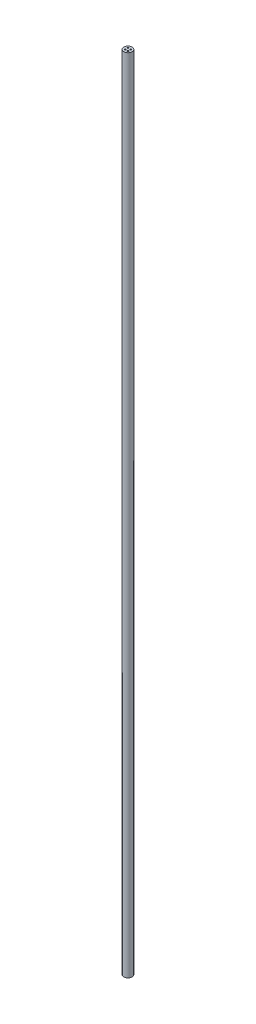
ISO-10303-21;
HEADER;
FILE_DESCRIPTION(('STEP AP214'),'2;1');
FILE_NAME('part.step','',(''),(''),'','','');
FILE_SCHEMA(('AUTOMOTIVE_DESIGN { 1 0 10303 214 1 1 1 1 }'));
ENDSEC;
DATA;
#1=APPLICATION_CONTEXT('core data for automotive mechanical design processes');
#2=APPLICATION_PROTOCOL_DEFINITION('international standard','automotive_design',2000,#1);
#3=PRODUCT_CONTEXT('',#1,'mechanical');
#4=PRODUCT('Part','Part','',(#3));
#5=PRODUCT_RELATED_PRODUCT_CATEGORY('part','',(#4));
#6=PRODUCT_DEFINITION_FORMATION('','',#4);
#7=PRODUCT_DEFINITION_CONTEXT('part definition',#1,'design');
#8=PRODUCT_DEFINITION('design','',#6,#7);
#9=PRODUCT_DEFINITION_SHAPE('','',#8);
#10=(LENGTH_UNIT() NAMED_UNIT(*) SI_UNIT(.MILLI.,.METRE.));
#11=(NAMED_UNIT(*) PLANE_ANGLE_UNIT() SI_UNIT($,.RADIAN.));
#12=(NAMED_UNIT(*) SI_UNIT($,.STERADIAN.) SOLID_ANGLE_UNIT());
#13=UNCERTAINTY_MEASURE_WITH_UNIT(LENGTH_MEASURE(1.E-05),#10,'distance_accuracy_value','');
#14=(GEOMETRIC_REPRESENTATION_CONTEXT(3) GLOBAL_UNCERTAINTY_ASSIGNED_CONTEXT((#13)) GLOBAL_UNIT_ASSIGNED_CONTEXT((#10,
#11,#12)) REPRESENTATION_CONTEXT('',''));
#15=CARTESIAN_POINT('',(0.,0.,0.));
#16=DIRECTION('',(0.,0.,1.));
#17=DIRECTION('',(1.,0.,0.));
#18=AXIS2_PLACEMENT_3D('',#15,#16,#17);
#19=CARTESIAN_POINT('',(0.,-152.4,0.));
#20=DIRECTION('',(0.,1.,0.));
#21=DIRECTION('',(0.,0.,1.));
#22=AXIS2_PLACEMENT_3D('',#19,#20,#21);
#23=CYLINDRICAL_SURFACE('',#22,0.7874);
#24=CARTESIAN_POINT('',(0.,-152.4,0.));
#25=DIRECTION('',(0.,1.,0.));
#26=DIRECTION('',(0.,0.,1.));
#27=AXIS2_PLACEMENT_3D('',#24,#25,#26);
#28=CIRCLE('',#27,0.7874);
#29=CARTESIAN_POINT('',(0.,-152.4,0.7874));
#30=VERTEX_POINT('',#29);
#31=EDGE_CURVE('E10',#30,#30,#28,.T.);
#32=CARTESIAN_POINT('',(0.,0.,0.));
#33=DIRECTION('',(0.,1.,0.));
#34=DIRECTION('',(0.,0.,1.));
#35=AXIS2_PLACEMENT_3D('',#32,#33,#34);
#36=CIRCLE('',#35,0.7874);
#37=CARTESIAN_POINT('',(0.,0.,0.7874));
#38=VERTEX_POINT('',#37);
#39=EDGE_CURVE('E34',#38,#38,#36,.T.);
#40=CARTESIAN_POINT('',(0.,-152.4,0.7874));
#41=CARTESIAN_POINT('',(0.,-150.8125,0.7874));
#42=CARTESIAN_POINT('',(0.,-149.225,0.7874));
#43=CARTESIAN_POINT('',(0.,-146.05,0.7874));
#44=CARTESIAN_POINT('',(0.,-144.4625,0.7874));
#45=CARTESIAN_POINT('',(0.,-141.2875,0.7874));
#46=CARTESIAN_POINT('',(0.,-139.7,0.7874));
#47=CARTESIAN_POINT('',(0.,-136.525,0.7874));
#48=CARTESIAN_POINT('',(0.,-134.9375,0.7874));
#49=CARTESIAN_POINT('',(0.,-131.7625,0.7874));
#50=CARTESIAN_POINT('',(0.,-130.175,0.7874));
#51=CARTESIAN_POINT('',(0.,-127.,0.7874));
#52=CARTESIAN_POINT('',(0.,-125.4125,0.7874));
#53=CARTESIAN_POINT('',(0.,-122.2375,0.7874));
#54=CARTESIAN_POINT('',(0.,-120.65,0.7874));
#55=CARTESIAN_POINT('',(0.,-117.475,0.7874));
#56=CARTESIAN_POINT('',(0.,-115.8875,0.7874));
#57=CARTESIAN_POINT('',(0.,-112.7125,0.7874));
#58=CARTESIAN_POINT('',(0.,-111.125,0.7874));
#59=CARTESIAN_POINT('',(0.,-107.95,0.7874));
#60=CARTESIAN_POINT('',(0.,-106.3625,0.7874));
#61=CARTESIAN_POINT('',(0.,-103.1875,0.7874));
#62=CARTESIAN_POINT('',(0.,-101.6,0.7874));
#63=CARTESIAN_POINT('',(0.,-98.425,0.7874));
#64=CARTESIAN_POINT('',(0.,-96.8375,0.7874));
#65=CARTESIAN_POINT('',(0.,-93.6625,0.7874));
#66=CARTESIAN_POINT('',(0.,-92.075,0.7874));
#67=CARTESIAN_POINT('',(0.,-88.9,0.7874));
#68=CARTESIAN_POINT('',(0.,-87.3125,0.7874));
#69=CARTESIAN_POINT('',(0.,-84.1375,0.7874));
#70=CARTESIAN_POINT('',(0.,-82.55,0.7874));
#71=CARTESIAN_POINT('',(0.,-79.375,0.7874));
#72=CARTESIAN_POINT('',(0.,-77.7875,0.7874));
#73=CARTESIAN_POINT('',(0.,-74.6125,0.7874));
#74=CARTESIAN_POINT('',(0.,-73.025,0.7874));
#75=CARTESIAN_POINT('',(0.,-69.85,0.7874));
#76=CARTESIAN_POINT('',(0.,-68.2625,0.7874));
#77=CARTESIAN_POINT('',(0.,-65.0875,0.7874));
#78=CARTESIAN_POINT('',(0.,-63.5,0.7874));
#79=CARTESIAN_POINT('',(0.,-60.325,0.7874));
#80=CARTESIAN_POINT('',(0.,-58.7375,0.7874));
#81=CARTESIAN_POINT('',(0.,-55.5625,0.7874));
#82=CARTESIAN_POINT('',(0.,-53.975,0.7874));
#83=CARTESIAN_POINT('',(0.,-50.8,0.7874));
#84=CARTESIAN_POINT('',(0.,-49.2125,0.7874));
#85=CARTESIAN_POINT('',(0.,-46.0375,0.7874));
#86=CARTESIAN_POINT('',(0.,-44.45,0.7874));
#87=CARTESIAN_POINT('',(0.,-41.275,0.7874));
#88=CARTESIAN_POINT('',(0.,-39.6875,0.7874));
#89=CARTESIAN_POINT('',(0.,-36.5125,0.7874));
#90=CARTESIAN_POINT('',(0.,-34.925,0.7874));
#91=CARTESIAN_POINT('',(0.,-31.75,0.7874));
#92=CARTESIAN_POINT('',(0.,-30.1625,0.7874));
#93=CARTESIAN_POINT('',(0.,-26.9875,0.7874));
#94=CARTESIAN_POINT('',(0.,-25.4,0.7874));
#95=CARTESIAN_POINT('',(0.,-22.225,0.7874));
#96=CARTESIAN_POINT('',(0.,-20.6375,0.7874));
#97=CARTESIAN_POINT('',(0.,-17.4625,0.7874));
#98=CARTESIAN_POINT('',(0.,-15.875,0.7874));
#99=CARTESIAN_POINT('',(0.,-12.7,0.7874));
#100=CARTESIAN_POINT('',(0.,-11.1125,0.7874));
#101=CARTESIAN_POINT('',(0.,-7.93750000000001,0.7874));
#102=CARTESIAN_POINT('',(0.,-6.35,0.7874));
#103=CARTESIAN_POINT('',(0.,-3.175,0.7874));
#104=CARTESIAN_POINT('',(0.,-1.5875,0.7874));
#105=CARTESIAN_POINT('',(0.,0.,0.7874));
#106=B_SPLINE_CURVE_WITH_KNOTS('',3,(#40,#41,#42,#43,#44,#45,#46,#47,#48,#49,#50,#51,#52,#53,
#54,#55,#56,#57,#58,#59,#60,#61,#62,#63,#64,#65,#66,#67,#68,#69,#70,#71,#72,#73,#74,#75,#76,#77,
#78,#79,#80,#81,#82,#83,#84,#85,#86,#87,#88,#89,#90,#91,#92,#93,#94,#95,#96,#97,#98,#99,#100,
#101,#102,#103,#104,#105),.UNSPECIFIED.,.F.,.F.,(4,2,2,2,2,2,2,2,2,2,2,2,2,2,2,2,2,2,2,2,2,2,2,
2,2,2,2,2,2,2,2,2,4),(0.,4.76249999999998,9.52499999999998,14.2875,19.05,23.8125,28.575,33.3375,
38.1,42.8625,47.625,52.3875,57.15,61.9125,66.675,71.4375,76.2,80.9625,85.725,90.4875,95.25,
100.0125,104.775,109.5375,114.3,119.0625,123.825,128.5875,133.35,138.1125,142.875,147.6375,
152.4),.UNSPECIFIED.);
#107=EDGE_CURVE('BSEAM31',#30,#38,#106,.T.);
#108=ORIENTED_EDGE('',*,*,#31,.T.);
#109=ORIENTED_EDGE('',*,*,#39,.F.);
#110=ORIENTED_EDGE('',*,*,#107,.T.);
#111=ORIENTED_EDGE('',*,*,#107,.F.);
#112=EDGE_LOOP('',(#108,#110,#109,#111));
#113=FACE_BOUND('',#112,.T.);
#114=ADVANCED_FACE('F31',(#113),#23,.T.);
#115=CARTESIAN_POINT('',(0.,-152.4,0.));
#116=DIRECTION('',(0.,1.,0.));
#117=DIRECTION('',(0.,0.,1.));
#118=AXIS2_PLACEMENT_3D('',#115,#116,#117);
#119=PLANE('',#118);
#120=CARTESIAN_POINT('',(0.254,-152.4,0.254));
#121=DIRECTION('',(0.,1.,0.));
#122=DIRECTION('',(0.,0.,1.));
#123=AXIS2_PLACEMENT_3D('',#120,#121,#122);
#124=CIRCLE('',#123,0.127);
#125=CARTESIAN_POINT('',(0.254,-152.4,0.381));
#126=VERTEX_POINT('',#125);
#127=EDGE_CURVE('E58',#126,#126,#124,.T.);
#128=ORIENTED_EDGE('',*,*,#127,.T.);
#129=EDGE_LOOP('',(#128));
#130=FACE_BOUND('',#129,.T.);
#131=CARTESIAN_POINT('',(-0.254,-152.4,0.254));
#132=DIRECTION('',(0.,1.,0.));
#133=DIRECTION('',(0.,0.,1.));
#134=AXIS2_PLACEMENT_3D('',#131,#132,#133);
#135=CIRCLE('',#134,0.127);
#136=CARTESIAN_POINT('',(-0.254,-152.4,0.381));
#137=VERTEX_POINT('',#136);
#138=EDGE_CURVE('E52',#137,#137,#135,.T.);
#139=ORIENTED_EDGE('',*,*,#138,.T.);
#140=EDGE_LOOP('',(#139));
#141=FACE_BOUND('',#140,.T.);
#142=CARTESIAN_POINT('',(0.254,-152.4,-0.254));
#143=DIRECTION('',(0.,1.,0.));
#144=DIRECTION('',(0.,0.,1.));
#145=AXIS2_PLACEMENT_3D('',#142,#143,#144);
#146=CIRCLE('',#145,0.127);
#147=CARTESIAN_POINT('',(0.254,-152.4,-0.127));
#148=VERTEX_POINT('',#147);
#149=EDGE_CURVE('E46',#148,#148,#146,.T.);
#150=ORIENTED_EDGE('',*,*,#149,.T.);
#151=EDGE_LOOP('',(#150));
#152=FACE_BOUND('',#151,.T.);
#153=CARTESIAN_POINT('',(-0.254,-152.4,-0.254));
#154=DIRECTION('',(0.,1.,0.));
#155=DIRECTION('',(0.,0.,1.));
#156=AXIS2_PLACEMENT_3D('',#153,#154,#155);
#157=CIRCLE('',#156,0.127);
#158=CARTESIAN_POINT('',(-0.254,-152.4,-0.127));
#159=VERTEX_POINT('',#158);
#160=EDGE_CURVE('E41',#159,#159,#157,.T.);
#161=ORIENTED_EDGE('',*,*,#160,.T.);
#162=EDGE_LOOP('',(#161));
#163=FACE_BOUND('',#162,.T.);
#164=ORIENTED_EDGE('',*,*,#31,.F.);
#165=EDGE_LOOP('',(#164));
#166=FACE_BOUND('',#165,.T.);
#167=ADVANCED_FACE('F67',(#130,#141,#152,#163,#166),#119,.F.);
#168=CARTESIAN_POINT('',(0.,0.,0.));
#169=DIRECTION('',(0.,1.,0.));
#170=DIRECTION('',(0.,0.,1.));
#171=AXIS2_PLACEMENT_3D('',#168,#169,#170);
#172=PLANE('',#171);
#173=CARTESIAN_POINT('',(0.254,0.,0.254));
#174=DIRECTION('',(0.,1.,0.));
#175=DIRECTION('',(0.,0.,1.));
#176=AXIS2_PLACEMENT_3D('',#173,#174,#175);
#177=CIRCLE('',#176,0.127);
#178=CARTESIAN_POINT('',(0.254,0.,0.381));
#179=VERTEX_POINT('',#178);
#180=EDGE_CURVE('E61',#179,#179,#177,.T.);
#181=ORIENTED_EDGE('',*,*,#180,.F.);
#182=EDGE_LOOP('',(#181));
#183=FACE_BOUND('',#182,.T.);
#184=CARTESIAN_POINT('',(-0.254,0.,0.254));
#185=DIRECTION('',(0.,1.,0.));
#186=DIRECTION('',(0.,0.,1.));
#187=AXIS2_PLACEMENT_3D('',#184,#185,#186);
#188=CIRCLE('',#187,0.127);
#189=CARTESIAN_POINT('',(-0.254,0.,0.381));
#190=VERTEX_POINT('',#189);
#191=EDGE_CURVE('E55',#190,#190,#188,.T.);
#192=ORIENTED_EDGE('',*,*,#191,.F.);
#193=EDGE_LOOP('',(#192));
#194=FACE_BOUND('',#193,.T.);
#195=CARTESIAN_POINT('',(0.254,0.,-0.254));
#196=DIRECTION('',(0.,1.,0.));
#197=DIRECTION('',(0.,0.,1.));
#198=AXIS2_PLACEMENT_3D('',#195,#196,#197);
#199=CIRCLE('',#198,0.127);
#200=CARTESIAN_POINT('',(0.254,0.,-0.127));
#201=VERTEX_POINT('',#200);
#202=EDGE_CURVE('E49',#201,#201,#199,.T.);
#203=ORIENTED_EDGE('',*,*,#202,.F.);
#204=EDGE_LOOP('',(#203));
#205=FACE_BOUND('',#204,.T.);
#206=CARTESIAN_POINT('',(-0.254,0.,-0.254));
#207=DIRECTION('',(0.,1.,0.));
#208=DIRECTION('',(0.,0.,1.));
#209=AXIS2_PLACEMENT_3D('',#206,#207,#208);
#210=CIRCLE('',#209,0.127);
#211=CARTESIAN_POINT('',(-0.254,0.,-0.127));
#212=VERTEX_POINT('',#211);
#213=EDGE_CURVE('E43',#212,#212,#210,.T.);
#214=ORIENTED_EDGE('',*,*,#213,.F.);
#215=EDGE_LOOP('',(#214));
#216=FACE_BOUND('',#215,.T.);
#217=ORIENTED_EDGE('',*,*,#39,.T.);
#218=EDGE_LOOP('',(#217));
#219=FACE_BOUND('',#218,.T.);
#220=ADVANCED_FACE('F77',(#183,#194,#205,#216,#219),#172,.T.);
#221=CARTESIAN_POINT('',(-0.254,-152.4,-0.254));
#222=DIRECTION('',(0.,1.,0.));
#223=DIRECTION('',(0.,0.,1.));
#224=AXIS2_PLACEMENT_3D('',#221,#222,#223);
#225=CYLINDRICAL_SURFACE('',#224,0.127);
#226=ORIENTED_EDGE('',*,*,#160,.F.);
#227=EDGE_LOOP('',(#226));
#228=FACE_BOUND('',#227,.T.);
#229=ORIENTED_EDGE('',*,*,#213,.T.);
#230=EDGE_LOOP('',(#229));
#231=FACE_BOUND('',#230,.T.);
#232=ADVANCED_FACE('F80',(#228,#231),#225,.F.);
#233=CARTESIAN_POINT('',(0.254,-152.4,-0.254));
#234=DIRECTION('',(0.,1.,0.));
#235=DIRECTION('',(0.,0.,1.));
#236=AXIS2_PLACEMENT_3D('',#233,#234,#235);
#237=CYLINDRICAL_SURFACE('',#236,0.127);
#238=ORIENTED_EDGE('',*,*,#149,.F.);
#239=EDGE_LOOP('',(#238));
#240=FACE_BOUND('',#239,.T.);
#241=ORIENTED_EDGE('',*,*,#202,.T.);
#242=EDGE_LOOP('',(#241));
#243=FACE_BOUND('',#242,.T.);
#244=ADVANCED_FACE('F99',(#240,#243),#237,.F.);
#245=CARTESIAN_POINT('',(-0.254,-152.4,0.254));
#246=DIRECTION('',(0.,1.,0.));
#247=DIRECTION('',(0.,0.,1.));
#248=AXIS2_PLACEMENT_3D('',#245,#246,#247);
#249=CYLINDRICAL_SURFACE('',#248,0.127);
#250=ORIENTED_EDGE('',*,*,#138,.F.);
#251=EDGE_LOOP('',(#250));
#252=FACE_BOUND('',#251,.T.);
#253=ORIENTED_EDGE('',*,*,#191,.T.);
#254=EDGE_LOOP('',(#253));
#255=FACE_BOUND('',#254,.T.);
#256=ADVANCED_FACE('F73',(#252,#255),#249,.F.);
#257=CARTESIAN_POINT('',(0.254,-152.4,0.254));
#258=DIRECTION('',(0.,1.,0.));
#259=DIRECTION('',(0.,0.,1.));
#260=AXIS2_PLACEMENT_3D('',#257,#258,#259);
#261=CYLINDRICAL_SURFACE('',#260,0.127);
#262=ORIENTED_EDGE('',*,*,#127,.F.);
#263=EDGE_LOOP('',(#262));
#264=FACE_BOUND('',#263,.T.);
#265=ORIENTED_EDGE('',*,*,#180,.T.);
#266=EDGE_LOOP('',(#265));
#267=FACE_BOUND('',#266,.T.);
#268=ADVANCED_FACE('F70',(#264,#267),#261,.F.);
#269=CLOSED_SHELL('',(#114,#167,#220,#232,#244,#256,#268));
#270=MANIFOLD_SOLID_BREP('B2',#269);
#271=ADVANCED_BREP_SHAPE_REPRESENTATION('',(#18,#270),#14);
#272=SHAPE_DEFINITION_REPRESENTATION(#9,#271);
ENDSEC;
END-ISO-10303-21;
